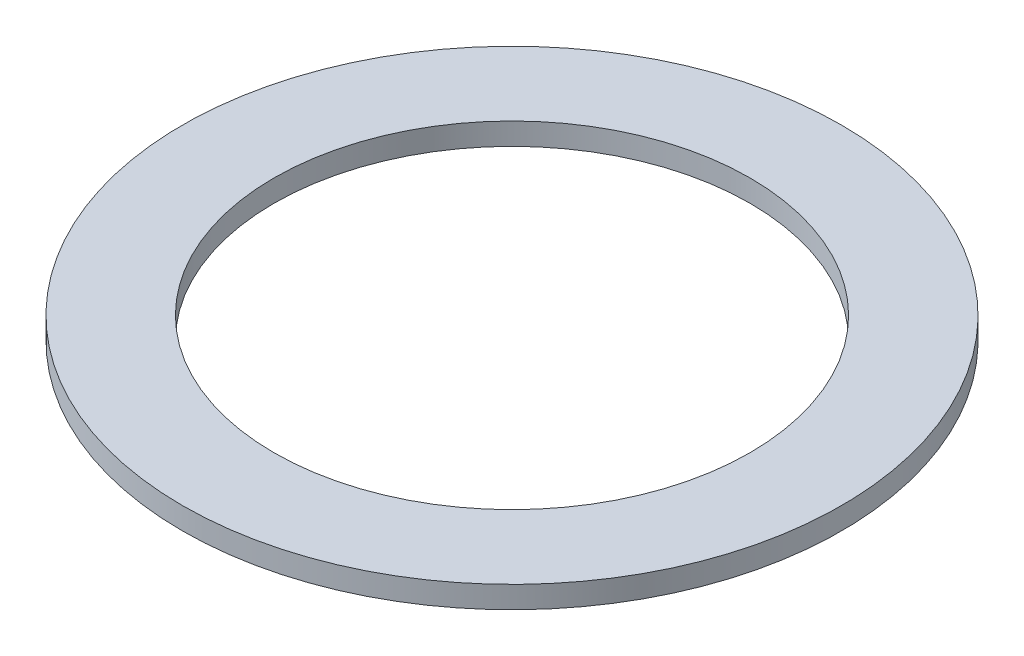
ISO-10303-21;
HEADER;
FILE_DESCRIPTION(('STEP AP214'),'2;1');
FILE_NAME('part.step','',(''),(''),'','','');
FILE_SCHEMA(('AUTOMOTIVE_DESIGN { 1 0 10303 214 1 1 1 1 }'));
ENDSEC;
DATA;
#1=APPLICATION_CONTEXT('core data for automotive mechanical design processes');
#2=APPLICATION_PROTOCOL_DEFINITION('international standard','automotive_design',2000,#1);
#3=PRODUCT_CONTEXT('',#1,'mechanical');
#4=PRODUCT('Part','Part','',(#3));
#5=PRODUCT_RELATED_PRODUCT_CATEGORY('part','',(#4));
#6=PRODUCT_DEFINITION_FORMATION('','',#4);
#7=PRODUCT_DEFINITION_CONTEXT('part definition',#1,'design');
#8=PRODUCT_DEFINITION('design','',#6,#7);
#9=PRODUCT_DEFINITION_SHAPE('','',#8);
#10=(LENGTH_UNIT() NAMED_UNIT(*) SI_UNIT(.MILLI.,.METRE.));
#11=(NAMED_UNIT(*) PLANE_ANGLE_UNIT() SI_UNIT($,.RADIAN.));
#12=(NAMED_UNIT(*) SI_UNIT($,.STERADIAN.) SOLID_ANGLE_UNIT());
#13=UNCERTAINTY_MEASURE_WITH_UNIT(LENGTH_MEASURE(1.E-05),#10,'distance_accuracy_value','');
#14=(GEOMETRIC_REPRESENTATION_CONTEXT(3) GLOBAL_UNCERTAINTY_ASSIGNED_CONTEXT((#13)) GLOBAL_UNIT_ASSIGNED_CONTEXT((#10,
#11,#12)) REPRESENTATION_CONTEXT('',''));
#15=CARTESIAN_POINT('',(0.,0.,0.));
#16=DIRECTION('',(0.,0.,1.));
#17=DIRECTION('',(1.,0.,0.));
#18=AXIS2_PLACEMENT_3D('',#15,#16,#17);
#19=CARTESIAN_POINT('',(0.,3.,0.));
#20=DIRECTION('',(0.,1.,0.));
#21=DIRECTION('',(0.,0.,1.));
#22=AXIS2_PLACEMENT_3D('',#19,#20,#21);
#23=PLANE('',#22);
#24=CARTESIAN_POINT('',(0.,3.,0.));
#25=DIRECTION('',(0.,1.,0.));
#26=DIRECTION('',(0.,0.,1.));
#27=AXIS2_PLACEMENT_3D('',#24,#25,#26);
#28=CIRCLE('',#27,45.);
#29=CARTESIAN_POINT('',(0.,3.,45.));
#30=VERTEX_POINT('',#29);
#31=EDGE_CURVE('E10',#30,#30,#28,.T.);
#32=ORIENTED_EDGE('',*,*,#31,.T.);
#33=EDGE_LOOP('',(#32));
#34=FACE_BOUND('',#33,.T.);
#35=CARTESIAN_POINT('',(0.,3.,0.));
#36=DIRECTION('',(0.,1.,0.));
#37=DIRECTION('',(0.,0.,1.));
#38=AXIS2_PLACEMENT_3D('',#35,#36,#37);
#39=CIRCLE('',#38,32.5);
#40=CARTESIAN_POINT('',(0.,3.,32.5));
#41=VERTEX_POINT('',#40);
#42=EDGE_CURVE('E45',#41,#41,#39,.T.);
#43=ORIENTED_EDGE('',*,*,#42,.F.);
#44=EDGE_LOOP('',(#43));
#45=FACE_BOUND('',#44,.T.);
#46=ADVANCED_FACE('F34',(#34,#45),#23,.T.);
#47=CARTESIAN_POINT('',(0.,0.,0.));
#48=DIRECTION('',(0.,1.,0.));
#49=DIRECTION('',(0.,0.,1.));
#50=AXIS2_PLACEMENT_3D('',#47,#48,#49);
#51=PLANE('',#50);
#52=CARTESIAN_POINT('',(0.,0.,0.));
#53=DIRECTION('',(0.,1.,0.));
#54=DIRECTION('',(0.,0.,1.));
#55=AXIS2_PLACEMENT_3D('',#52,#53,#54);
#56=CIRCLE('',#55,45.);
#57=CARTESIAN_POINT('',(0.,0.,45.));
#58=VERTEX_POINT('',#57);
#59=EDGE_CURVE('E38',#58,#58,#56,.T.);
#60=ORIENTED_EDGE('',*,*,#59,.F.);
#61=EDGE_LOOP('',(#60));
#62=FACE_BOUND('',#61,.T.);
#63=CARTESIAN_POINT('',(0.,0.,0.));
#64=DIRECTION('',(0.,1.,0.));
#65=DIRECTION('',(0.,0.,1.));
#66=AXIS2_PLACEMENT_3D('',#63,#64,#65);
#67=CIRCLE('',#66,32.5);
#68=CARTESIAN_POINT('',(0.,0.,32.5));
#69=VERTEX_POINT('',#68);
#70=EDGE_CURVE('E47',#69,#69,#67,.T.);
#71=ORIENTED_EDGE('',*,*,#70,.T.);
#72=EDGE_LOOP('',(#71));
#73=FACE_BOUND('',#72,.T.);
#74=ADVANCED_FACE('F57',(#62,#73),#51,.F.);
#75=CARTESIAN_POINT('',(0.,3.,0.));
#76=DIRECTION('',(0.,-1.,0.));
#77=DIRECTION('',(0.,0.,-1.));
#78=AXIS2_PLACEMENT_3D('',#75,#76,#77);
#79=CYLINDRICAL_SURFACE('',#78,45.);
#80=ORIENTED_EDGE('',*,*,#31,.F.);
#81=EDGE_LOOP('',(#80));
#82=FACE_BOUND('',#81,.T.);
#83=ORIENTED_EDGE('',*,*,#59,.T.);
#84=EDGE_LOOP('',(#83));
#85=FACE_BOUND('',#84,.T.);
#86=ADVANCED_FACE('F36',(#82,#85),#79,.T.);
#87=CARTESIAN_POINT('',(0.,3.,0.));
#88=DIRECTION('',(0.,-1.,0.));
#89=DIRECTION('',(0.,0.,-1.));
#90=AXIS2_PLACEMENT_3D('',#87,#88,#89);
#91=CYLINDRICAL_SURFACE('',#90,32.5);
#92=ORIENTED_EDGE('',*,*,#42,.T.);
#93=EDGE_LOOP('',(#92));
#94=FACE_BOUND('',#93,.T.);
#95=ORIENTED_EDGE('',*,*,#70,.F.);
#96=EDGE_LOOP('',(#95));
#97=FACE_BOUND('',#96,.T.);
#98=ADVANCED_FACE('F53',(#94,#97),#91,.F.);
#99=CLOSED_SHELL('',(#46,#74,#86,#98));
#100=MANIFOLD_SOLID_BREP('B2',#99);
#101=ADVANCED_BREP_SHAPE_REPRESENTATION('',(#18,#100),#14);
#102=SHAPE_DEFINITION_REPRESENTATION(#9,#101);
ENDSEC;
END-ISO-10303-21;
